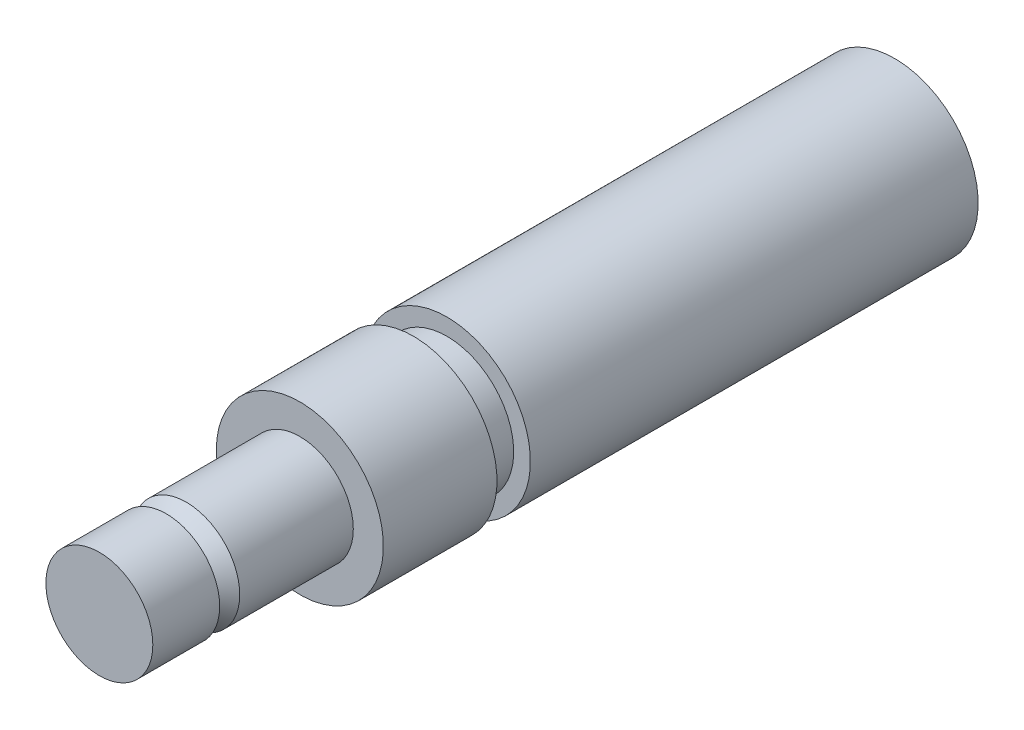
ISO-10303-21;
HEADER;
FILE_DESCRIPTION(('STEP AP214'),'2;1');
FILE_NAME('part.step','',(''),(''),'','','');
FILE_SCHEMA(('AUTOMOTIVE_DESIGN { 1 0 10303 214 1 1 1 1 }'));
ENDSEC;
DATA;
#1=APPLICATION_CONTEXT('core data for automotive mechanical design processes');
#2=APPLICATION_PROTOCOL_DEFINITION('international standard','automotive_design',2000,#1);
#3=PRODUCT_CONTEXT('',#1,'mechanical');
#4=PRODUCT('Part','Part','',(#3));
#5=PRODUCT_RELATED_PRODUCT_CATEGORY('part','',(#4));
#6=PRODUCT_DEFINITION_FORMATION('','',#4);
#7=PRODUCT_DEFINITION_CONTEXT('part definition',#1,'design');
#8=PRODUCT_DEFINITION('design','',#6,#7);
#9=PRODUCT_DEFINITION_SHAPE('','',#8);
#10=(LENGTH_UNIT() NAMED_UNIT(*) SI_UNIT(.MILLI.,.METRE.));
#11=(NAMED_UNIT(*) PLANE_ANGLE_UNIT() SI_UNIT($,.RADIAN.));
#12=(NAMED_UNIT(*) SI_UNIT($,.STERADIAN.) SOLID_ANGLE_UNIT());
#13=UNCERTAINTY_MEASURE_WITH_UNIT(LENGTH_MEASURE(1.E-05),#10,'distance_accuracy_value','');
#14=(GEOMETRIC_REPRESENTATION_CONTEXT(3) GLOBAL_UNCERTAINTY_ASSIGNED_CONTEXT((#13)) GLOBAL_UNIT_ASSIGNED_CONTEXT((#10,
#11,#12)) REPRESENTATION_CONTEXT('',''));
#15=CARTESIAN_POINT('',(0.,0.,0.));
#16=DIRECTION('',(0.,0.,1.));
#17=DIRECTION('',(1.,0.,0.));
#18=AXIS2_PLACEMENT_3D('',#15,#16,#17);
#19=CARTESIAN_POINT('',(0.,0.,10.9));
#20=DIRECTION('',(0.,0.,1.));
#21=DIRECTION('',(1.,0.,0.));
#22=AXIS2_PLACEMENT_3D('',#19,#20,#21);
#23=PLANE('',#22);
#24=CARTESIAN_POINT('',(0.,0.,10.9));
#25=DIRECTION('',(0.,0.,1.));
#26=DIRECTION('',(1.,0.,0.));
#27=AXIS2_PLACEMENT_3D('',#24,#25,#26);
#28=CIRCLE('',#27,0.8);
#29=CARTESIAN_POINT('',(0.8,0.,10.9));
#30=VERTEX_POINT('',#29);
#31=EDGE_CURVE('E20',#30,#30,#28,.F.);
#32=ORIENTED_EDGE('',*,*,#31,.F.);
#33=EDGE_LOOP('',(#32));
#34=FACE_BOUND('',#33,.T.);
#35=ADVANCED_FACE('F17',(#34),#23,.T.);
#36=CARTESIAN_POINT('',(0.,0.,9.9));
#37=DIRECTION('',(0.,0.,1.));
#38=DIRECTION('',(1.,0.,0.));
#39=AXIS2_PLACEMENT_3D('',#36,#37,#38);
#40=CYLINDRICAL_SURFACE('',#39,0.8);
#41=ORIENTED_EDGE('',*,*,#31,.T.);
#42=EDGE_LOOP('',(#41));
#43=FACE_BOUND('',#42,.T.);
#44=CARTESIAN_POINT('',(0.,0.,9.9));
#45=DIRECTION('',(0.,0.,1.));
#46=DIRECTION('',(1.,0.,0.));
#47=AXIS2_PLACEMENT_3D('',#44,#45,#46);
#48=CIRCLE('',#47,0.8);
#49=CARTESIAN_POINT('',(0.8,0.,9.9));
#50=VERTEX_POINT('',#49);
#51=EDGE_CURVE('E254',#50,#50,#48,.T.);
#52=ORIENTED_EDGE('',*,*,#51,.T.);
#53=EDGE_LOOP('',(#52));
#54=FACE_BOUND('',#53,.T.);
#55=ADVANCED_FACE('F229',(#43,#54),#40,.T.);
#56=CARTESIAN_POINT('',(0.,0.,9.9));
#57=DIRECTION('',(0.,0.,1.));
#58=DIRECTION('',(1.,0.,0.));
#59=AXIS2_PLACEMENT_3D('',#56,#57,#58);
#60=PLANE('',#59);
#61=CARTESIAN_POINT('',(0.,0.,9.90000000001601));
#62=DIRECTION('',(0.,0.,-1.));
#63=DIRECTION('',(-1.,0.,0.));
#64=AXIS2_PLACEMENT_3D('',#61,#62,#63);
#65=CIRCLE('',#64,0.499999999931333);
#66=CARTESIAN_POINT('',(-0.499999999931333,0.,9.90000000001601));
#67=VERTEX_POINT('',#66);
#68=EDGE_CURVE('E122',#67,#67,#65,.T.);
#69=ORIENTED_EDGE('',*,*,#68,.F.);
#70=EDGE_LOOP('',(#69));
#71=FACE_BOUND('',#70,.T.);
#72=ORIENTED_EDGE('',*,*,#51,.F.);
#73=EDGE_LOOP('',(#72));
#74=FACE_BOUND('',#73,.T.);
#75=ADVANCED_FACE('F220',(#71,#74),#60,.F.);
#76=CARTESIAN_POINT('',(0.,0.,9.60000000009131));
#77=DIRECTION('',(0.,0.,-1.));
#78=DIRECTION('',(-1.,0.,0.));
#79=AXIS2_PLACEMENT_3D('',#76,#77,#78);
#80=CONICAL_SURFACE('',#79,0.799999999856027,0.785398163397448);
#81=CARTESIAN_POINT('',(0.,0.,9.600000000002));
#82=DIRECTION('',(0.,0.,1.));
#83=DIRECTION('',(1.,0.,0.));
#84=AXIS2_PLACEMENT_3D('',#81,#82,#83);
#85=CIRCLE('',#84,0.8);
#86=CARTESIAN_POINT('',(0.8,0.,9.600000000002));
#87=VERTEX_POINT('',#86);
#88=EDGE_CURVE('E120',#87,#87,#85,.F.);
#89=ORIENTED_EDGE('',*,*,#88,.F.);
#90=EDGE_LOOP('',(#89));
#91=FACE_BOUND('',#90,.T.);
#92=ORIENTED_EDGE('',*,*,#68,.T.);
#93=EDGE_LOOP('',(#92));
#94=FACE_BOUND('',#93,.T.);
#95=ADVANCED_FACE('F211',(#91,#94),#80,.T.);
#96=CARTESIAN_POINT('',(0.,0.,7.9));
#97=DIRECTION('',(0.,0.,1.));
#98=DIRECTION('',(1.,0.,0.));
#99=AXIS2_PLACEMENT_3D('',#96,#97,#98);
#100=CYLINDRICAL_SURFACE('',#99,0.8);
#101=ORIENTED_EDGE('',*,*,#88,.T.);
#102=EDGE_LOOP('',(#101));
#103=FACE_BOUND('',#102,.T.);
#104=CARTESIAN_POINT('',(0.,0.,7.9));
#105=DIRECTION('',(0.,0.,1.));
#106=DIRECTION('',(1.,0.,0.));
#107=AXIS2_PLACEMENT_3D('',#104,#105,#106);
#108=CIRCLE('',#107,0.8);
#109=CARTESIAN_POINT('',(0.8,0.,7.9));
#110=VERTEX_POINT('',#109);
#111=EDGE_CURVE('E118',#110,#110,#108,.F.);
#112=ORIENTED_EDGE('',*,*,#111,.F.);
#113=EDGE_LOOP('',(#112));
#114=FACE_BOUND('',#113,.T.);
#115=ADVANCED_FACE('F42',(#103,#114),#100,.T.);
#116=CARTESIAN_POINT('',(0.,0.,7.9));
#117=DIRECTION('',(0.,0.,1.));
#118=DIRECTION('',(1.,0.,0.));
#119=AXIS2_PLACEMENT_3D('',#116,#117,#118);
#120=PLANE('',#119);
#121=ORIENTED_EDGE('',*,*,#111,.T.);
#122=EDGE_LOOP('',(#121));
#123=FACE_BOUND('',#122,.T.);
#124=CARTESIAN_POINT('',(0.,0.,7.9));
#125=DIRECTION('',(0.,0.,-1.));
#126=DIRECTION('',(-1.,0.,0.));
#127=AXIS2_PLACEMENT_3D('',#124,#125,#126);
#128=CIRCLE('',#127,1.25);
#129=CARTESIAN_POINT('',(-1.25,0.,7.9));
#130=VERTEX_POINT('',#129);
#131=EDGE_CURVE('E114',#130,#130,#128,.T.);
#132=ORIENTED_EDGE('',*,*,#131,.F.);
#133=EDGE_LOOP('',(#132));
#134=FACE_BOUND('',#133,.T.);
#135=ADVANCED_FACE('F31',(#123,#134),#120,.T.);
#136=CARTESIAN_POINT('',(0.,0.,4.9000000000774));
#137=DIRECTION('',(0.,0.,-1.));
#138=DIRECTION('',(-1.,0.,0.));
#139=AXIS2_PLACEMENT_3D('',#136,#137,#138);
#140=CONICAL_SURFACE('',#139,0.999999999748979,1.0297442583608);
#141=CARTESIAN_POINT('',(0.,0.,4.9));
#142=DIRECTION('',(0.,0.,-1.));
#143=DIRECTION('',(-1.,0.,0.));
#144=AXIS2_PLACEMENT_3D('',#141,#142,#143);
#145=CIRCLE('',#144,1.);
#146=CARTESIAN_POINT('',(-1.,0.,4.9));
#147=VERTEX_POINT('',#146);
#148=EDGE_CURVE('E111',#147,#147,#145,.T.);
#149=ORIENTED_EDGE('',*,*,#148,.T.);
#150=EDGE_LOOP('',(#149));
#151=FACE_BOUND('',#150,.T.);
#152=CARTESIAN_POINT('',(-2.55795384873636E-10,0.,5.50086061909383));
#153=VERTEX_POINT('',#152);
#154=VERTEX_LOOP('',#153);
#155=FACE_BOUND('',#154,.T.);
#156=ADVANCED_FACE('F28',(#151,#155),#140,.F.);
#157=CARTESIAN_POINT('',(0.,0.,6.6));
#158=DIRECTION('',(0.,0.,-1.));
#159=DIRECTION('',(-1.,0.,0.));
#160=AXIS2_PLACEMENT_3D('',#157,#158,#159);
#161=CYLINDRICAL_SURFACE('',#160,1.25);
#162=CARTESIAN_POINT('',(0.,0.,6.2));
#163=DIRECTION('',(0.,0.,-1.));
#164=DIRECTION('',(-1.,0.,0.));
#165=AXIS2_PLACEMENT_3D('',#162,#163,#164);
#166=CIRCLE('',#165,1.25);
#167=CARTESIAN_POINT('',(-1.25,0.,6.2));
#168=VERTEX_POINT('',#167);
#169=EDGE_CURVE('E94',#168,#168,#166,.T.);
#170=ORIENTED_EDGE('',*,*,#169,.F.);
#171=EDGE_LOOP('',(#170));
#172=FACE_BOUND('',#171,.T.);
#173=ORIENTED_EDGE('',*,*,#131,.T.);
#174=EDGE_LOOP('',(#173));
#175=FACE_BOUND('',#174,.T.);
#176=ADVANCED_FACE('F30',(#172,#175),#161,.T.);
#177=CARTESIAN_POINT('',(0.,0.,0.));
#178=DIRECTION('',(0.,0.,-1.));
#179=DIRECTION('',(-1.,0.,0.));
#180=AXIS2_PLACEMENT_3D('',#177,#178,#179);
#181=CYLINDRICAL_SURFACE('',#180,1.);
#182=CARTESIAN_POINT('',(0.,0.,-0.900000000001455));
#183=DIRECTION('',(0.,0.,-1.));
#184=DIRECTION('',(-1.,0.,0.));
#185=AXIS2_PLACEMENT_3D('',#182,#183,#184);
#186=CIRCLE('',#185,1.0000000000332);
#187=CARTESIAN_POINT('',(-1.0000000000332,0.,-0.900000000001455));
#188=VERTEX_POINT('',#187);
#189=EDGE_CURVE('E93',#188,#188,#186,.T.);
#190=ORIENTED_EDGE('',*,*,#189,.T.);
#191=EDGE_LOOP('',(#190));
#192=FACE_BOUND('',#191,.T.);
#193=CARTESIAN_POINT('',(0.,-1.,2.));
#194=CARTESIAN_POINT('',(0.0263072941996314,-0.99999882698595,2.00000133279081));
#195=CARTESIAN_POINT('',(0.0526293395636614,-0.998951575800265,2.00208682774252));
#196=CARTESIAN_POINT('',(0.104480295938417,-0.994868016465658,2.01033200327454));
#197=CARTESIAN_POINT('',(0.130008377804639,-0.99182969755529,2.01649580255873));
#198=CARTESIAN_POINT('',(0.179464997117567,-0.984081797255653,2.03259608555001));
#199=CARTESIAN_POINT('',(0.203398845810369,-0.97937813296223,2.04251922068789));
#200=CARTESIAN_POINT('',(0.249231794197029,-0.968730052928922,2.06578267799852));
#201=CARTESIAN_POINT('',(0.271130652545689,-0.962785490292046,2.07912340478677));
#202=CARTESIAN_POINT('',(0.313754382806793,-0.949781164602393,2.10975892503895));
#203=CARTESIAN_POINT('',(0.334328404641299,-0.942675724884289,2.12724390615065));
#204=CARTESIAN_POINT('',(0.37239037349671,-0.928299574229738,2.16526152170779));
#205=CARTESIAN_POINT('',(0.389876087308891,-0.921028747953146,2.18579634195166));
#206=CARTESIAN_POINT('',(0.422625970473862,-0.906494771172166,2.23124162737727));
#207=CARTESIAN_POINT('',(0.437612609390989,-0.899275963527821,2.25636794920579));
#208=CARTESIAN_POINT('',(0.463084070743218,-0.886429916161665,2.30918355840129));
#209=CARTESIAN_POINT('',(0.473572091350341,-0.880801546735004,2.33687100792304));
#210=CARTESIAN_POINT('',(0.489066211797564,-0.872289340449792,2.39233251820209));
#211=CARTESIAN_POINT('',(0.494362915132875,-0.869261365623398,2.4200021547411));
#212=CARTESIAN_POINT('',(0.500213494969292,-0.865909450690678,2.47598934591223));
#213=CARTESIAN_POINT('',(0.500772046188479,-0.865582845388517,2.5043062342861));
#214=CARTESIAN_POINT('',(0.497343642670328,-0.867554651968385,2.55714303093501));
#215=CARTESIAN_POINT('',(0.493892275474725,-0.869543821343265,2.58171205281882));
#216=CARTESIAN_POINT('',(0.48346991301851,-0.875381149456658,2.62986099048183));
#217=CARTESIAN_POINT('',(0.476497801916354,-0.879229897541171,2.6534405901123));
#218=CARTESIAN_POINT('',(0.459104800009827,-0.888437431778655,2.69961481508525));
#219=CARTESIAN_POINT('',(0.448607323306903,-0.893829318514657,2.72217367977794));
#220=CARTESIAN_POINT('',(0.424520538951912,-0.905517156168784,2.76531758850668));
#221=CARTESIAN_POINT('',(0.410929908291427,-0.911813493513579,2.7859017825627));
#222=CARTESIAN_POINT('',(0.379034666571405,-0.925565108151549,2.82725857113129));
#223=CARTESIAN_POINT('',(0.360350958372443,-0.933066147102269,2.8477245814866));
#224=CARTESIAN_POINT('',(0.319781661723617,-0.947736771952603,2.88536451225023));
#225=CARTESIAN_POINT('',(0.297893957434164,-0.954906134672052,2.90253623974699));
#226=CARTESIAN_POINT('',(0.250245525427099,-0.968513828138163,2.93385170040973));
#227=CARTESIAN_POINT('',(0.22435125280626,-0.974902069337732,2.94781553602781));
#228=CARTESIAN_POINT('',(0.170197879751449,-0.985794490438822,2.97105931648312));
#229=CARTESIAN_POINT('',(0.141943396215306,-0.990302249828193,2.98034816715722));
#230=CARTESIAN_POINT('',(0.0945428295096843,-0.995694761416512,2.99134610550181));
#231=CARTESIAN_POINT('',(0.0758201648790603,-0.997300886356791,2.99458315205222));
#232=CARTESIAN_POINT('',(0.0380675547500793,-0.999453877599474,2.99891047518163));
#233=CARTESIAN_POINT('',(0.0190376398898653,-1.00000084886796,3.00000096449264));
#234=CARTESIAN_POINT('',(-0.0263072941996313,-0.999998826985951,2.99999866720919));
#235=CARTESIAN_POINT('',(-0.0526293395636612,-0.998951575800265,2.99791317225748));
#236=CARTESIAN_POINT('',(-0.104480295938416,-0.994868016465658,2.98966799672546));
#237=CARTESIAN_POINT('',(-0.130008377804639,-0.99182969755529,2.98350419744127));
#238=CARTESIAN_POINT('',(-0.179464997117567,-0.984081797255653,2.96740391444999));
#239=CARTESIAN_POINT('',(-0.203398845810369,-0.97937813296223,2.95748077931211));
#240=CARTESIAN_POINT('',(-0.249231794197029,-0.968730052928923,2.93421732200148));
#241=CARTESIAN_POINT('',(-0.271130652545689,-0.962785490292046,2.92087659521323));
#242=CARTESIAN_POINT('',(-0.313754382806793,-0.949781164602393,2.89024107496105));
#243=CARTESIAN_POINT('',(-0.334328404641299,-0.942675724884288,2.87275609384935));
#244=CARTESIAN_POINT('',(-0.37239037349671,-0.928299574229737,2.83473847829221));
#245=CARTESIAN_POINT('',(-0.389876087308891,-0.921028747953146,2.81420365804834));
#246=CARTESIAN_POINT('',(-0.422625970473861,-0.906494771172166,2.76875837262273));
#247=CARTESIAN_POINT('',(-0.437612609390989,-0.899275963527821,2.74363205079421));
#248=CARTESIAN_POINT('',(-0.463084070743217,-0.886429916161665,2.69081644159871));
#249=CARTESIAN_POINT('',(-0.47357209135034,-0.880801546735004,2.66312899207696));
#250=CARTESIAN_POINT('',(-0.489066211797564,-0.872289340449792,2.60766748179791));
#251=CARTESIAN_POINT('',(-0.494362915132875,-0.869261365623398,2.5799978452589));
#252=CARTESIAN_POINT('',(-0.500213494969292,-0.865909450690678,2.52401065408777));
#253=CARTESIAN_POINT('',(-0.500772046188479,-0.865582845388517,2.4956937657139));
#254=CARTESIAN_POINT('',(-0.497343642670328,-0.867554651968385,2.44285696906499));
#255=CARTESIAN_POINT('',(-0.493892275474725,-0.869543821343265,2.41828794718118));
#256=CARTESIAN_POINT('',(-0.48346991301851,-0.875381149456659,2.37013900951817));
#257=CARTESIAN_POINT('',(-0.476497801916354,-0.879229897541171,2.3465594098877));
#258=CARTESIAN_POINT('',(-0.459104800009827,-0.888437431778655,2.30038518491475));
#259=CARTESIAN_POINT('',(-0.448607323306903,-0.893829318514657,2.27782632022206));
#260=CARTESIAN_POINT('',(-0.424520538951912,-0.905517156168784,2.23468241149332));
#261=CARTESIAN_POINT('',(-0.410929908291427,-0.911813493513579,2.2140982174373));
#262=CARTESIAN_POINT('',(-0.379034666571405,-0.925565108151549,2.17274142886871));
#263=CARTESIAN_POINT('',(-0.360350958372443,-0.933066147102269,2.1522754185134));
#264=CARTESIAN_POINT('',(-0.319781661723617,-0.947736771952603,2.11463548774977));
#265=CARTESIAN_POINT('',(-0.297893957434164,-0.954906134672052,2.09746376025301));
#266=CARTESIAN_POINT('',(-0.250245525427099,-0.968513828138163,2.06614829959028));
#267=CARTESIAN_POINT('',(-0.22435125280626,-0.974902069337732,2.05218446397219));
#268=CARTESIAN_POINT('',(-0.170197879751449,-0.985794490438821,2.02894068351688));
#269=CARTESIAN_POINT('',(-0.141943396215306,-0.990302249828193,2.01965183284278));
#270=CARTESIAN_POINT('',(-0.0945428295096842,-0.995694761416512,2.00865389449819));
#271=CARTESIAN_POINT('',(-0.0758201648790601,-0.997300886356792,2.00541684794778));
#272=CARTESIAN_POINT('',(-0.0380675547500791,-0.999453877599475,2.00108952481837));
#273=CARTESIAN_POINT('',(-0.0190376398898652,-1.00000084886796,1.99999903550736));
#274=CARTESIAN_POINT('',(0.,-1.,2.));
#275=B_SPLINE_CURVE_WITH_KNOTS('',3,(#193,#194,#195,#196,#197,#198,#199,#200,#201,#202,#203,
#204,#205,#206,#207,#208,#209,#210,#211,#212,#213,#214,#215,#216,#217,#218,#219,#220,#221,#222,
#223,#224,#225,#226,#227,#228,#229,#230,#231,#232,#233,#234,#235,#236,#237,#238,#239,#240,#241,
#242,#243,#244,#245,#246,#247,#248,#249,#250,#251,#252,#253,#254,#255,#256,#257,#258,#259,#260,
#261,#262,#263,#264,#265,#266,#267,#268,#269,#270,#271,#272,#273,#274),.UNSPECIFIED.,.T.,.F.,(4,
2,2,2,2,2,2,2,2,2,2,2,2,2,2,2,2,2,2,2,2,2,2,2,2,2,2,2,2,2,2,2,2,2,2,2,2,2,2,2,4),(0.,
0.0788471601427699,0.157774070291331,0.236423315979063,0.315081877414698,0.398492461227113,
0.481963115900232,0.57190845151623,0.661789736496116,0.746289949381505,0.830706783628623,
0.90502861517784,0.979374016599774,1.05545200908198,1.13156260311418,1.21731669237686,
1.30312766914582,1.39296528035204,1.48263109709754,1.53969559841525,1.59675444413864,
1.67560160428141,1.75452851442997,1.83317776011771,1.91183632155334,1.99524690536576,
2.07871756003888,2.16866289565487,2.25854418063476,2.34304439352015,2.42746122776727,
2.50178305931648,2.57612846073842,2.65220645322063,2.72831704725283,2.8140711365155,
2.89988211328446,2.98971972449069,3.07938554123619,3.1364500425539,3.19350888827729),.UNSPECIFIED.);
#276=CARTESIAN_POINT('',(0.,-1.,2.));
#277=VERTEX_POINT('',#276);
#278=EDGE_CURVE('E85',#277,#277,#275,.T.);
#279=ORIENTED_EDGE('',*,*,#278,.T.);
#280=EDGE_LOOP('',(#279));
#281=FACE_BOUND('',#280,.T.);
#282=ORIENTED_EDGE('',*,*,#148,.F.);
#283=EDGE_LOOP('',(#282));
#284=FACE_BOUND('',#283,.T.);
#285=ADVANCED_FACE('F39',(#192,#281,#284),#181,.F.);
#286=CARTESIAN_POINT('',(0.95,0.,6.2));
#287=DIRECTION('',(0.,0.,-1.));
#288=DIRECTION('',(-1.,0.,0.));
#289=AXIS2_PLACEMENT_3D('',#286,#287,#288);
#290=PLANE('',#289);
#291=CARTESIAN_POINT('',(0.,0.,6.2));
#292=DIRECTION('',(0.,0.,-1.));
#293=DIRECTION('',(-1.,0.,0.));
#294=AXIS2_PLACEMENT_3D('',#291,#292,#293);
#295=CIRCLE('',#294,1.);
#296=CARTESIAN_POINT('',(-1.,0.,6.2));
#297=VERTEX_POINT('',#296);
#298=EDGE_CURVE('E92',#297,#297,#295,.T.);
#299=ORIENTED_EDGE('',*,*,#298,.F.);
#300=EDGE_LOOP('',(#299));
#301=FACE_BOUND('',#300,.T.);
#302=ORIENTED_EDGE('',*,*,#169,.T.);
#303=EDGE_LOOP('',(#302));
#304=FACE_BOUND('',#303,.T.);
#305=ADVANCED_FACE('F98',(#301,#304),#290,.T.);
#306=CARTESIAN_POINT('',(0.,0.,-0.999999999976353));
#307=DIRECTION('',(0.,0.,-1.));
#308=DIRECTION('',(-1.,0.,0.));
#309=AXIS2_PLACEMENT_3D('',#306,#307,#308);
#310=CONICAL_SURFACE('',#309,1.10000000000809,0.785398163397448);
#311=CARTESIAN_POINT('',(0.,0.,-0.999999999976353));
#312=DIRECTION('',(0.,0.,-1.));
#313=DIRECTION('',(-1.,0.,0.));
#314=AXIS2_PLACEMENT_3D('',#311,#312,#313);
#315=CIRCLE('',#314,1.10000000000809);
#316=CARTESIAN_POINT('',(-1.10000000000809,0.,-0.999999999976353));
#317=VERTEX_POINT('',#316);
#318=EDGE_CURVE('E71',#317,#317,#315,.F.);
#319=ORIENTED_EDGE('',*,*,#318,.F.);
#320=EDGE_LOOP('',(#319));
#321=FACE_BOUND('',#320,.T.);
#322=ORIENTED_EDGE('',*,*,#189,.F.);
#323=EDGE_LOOP('',(#322));
#324=FACE_BOUND('',#323,.T.);
#325=ADVANCED_FACE('F80',(#321,#324),#310,.F.);
#326=CARTESIAN_POINT('',(0.,-10.,2.5));
#327=DIRECTION('',(0.,1.,0.));
#328=DIRECTION('',(0.,0.,1.));
#329=AXIS2_PLACEMENT_3D('',#326,#327,#328);
#330=CYLINDRICAL_SURFACE('',#329,0.5);
#331=ORIENTED_EDGE('',*,*,#278,.F.);
#332=EDGE_LOOP('',(#331));
#333=FACE_BOUND('',#332,.T.);
#334=CARTESIAN_POINT('',(0.,-1.25,3.));
#335=CARTESIAN_POINT('',(0.0269039658910112,-1.2499987602367,2.99999843526084));
#336=CARTESIAN_POINT('',(0.0538314236338625,-1.24912224361303,2.99781797004808));
#337=CARTESIAN_POINT('',(0.106904177585058,-1.24570522010588,2.9891795332913));
#338=CARTESIAN_POINT('',(0.133048294881686,-1.24316232515178,2.98271542274691));
#339=CARTESIAN_POINT('',(0.183735176026268,-1.23668610501994,2.96578246258056));
#340=CARTESIAN_POINT('',(0.20828219544184,-1.23275667054154,2.95532481234677));
#341=CARTESIAN_POINT('',(0.255260225119674,-1.22389316700826,2.93074991606284));
#342=CARTESIAN_POINT('',(0.277691262741417,-1.21895911094567,2.91663271733922));
#343=CARTESIAN_POINT('',(0.320876192673805,-1.20832700529545,2.88444048387529));
#344=CARTESIAN_POINT('',(0.341517205742932,-1.20260529448817,2.86622190858505));
#345=CARTESIAN_POINT('',(0.379545092300614,-1.1911509928089,2.82664832651192));
#346=CARTESIAN_POINT('',(0.396930629375506,-1.18541839844026,2.80529203805068));
#347=CARTESIAN_POINT('',(0.428718532311999,-1.17430701992359,2.75889315072488));
#348=CARTESIAN_POINT('',(0.442953546182462,-1.16895536532779,2.73372873363027));
#349=CARTESIAN_POINT('',(0.466938540903067,-1.15958417463853,2.6811162865088));
#350=CARTESIAN_POINT('',(0.476690589237171,-1.15556402471244,2.65366931607605));
#351=CARTESIAN_POINT('',(0.490974704979323,-1.14956589467383,2.59857192176988));
#352=CARTESIAN_POINT('',(0.495723489799348,-1.14750355168887,2.57098720211134));
#353=CARTESIAN_POINT('',(0.500543240129584,-1.14541001016283,2.51534126171609));
#354=CARTESIAN_POINT('',(0.500616504086554,-1.14537781361892,2.4872802818914));
#355=CARTESIAN_POINT('',(0.496247343729738,-1.14727625006616,2.43356084985857));
#356=CARTESIAN_POINT('',(0.492118835602052,-1.14907043513437,2.40787110665854));
#357=CARTESIAN_POINT('',(0.479986729710618,-1.15419046441189,2.35758514479415));
#358=CARTESIAN_POINT('',(0.471982450471788,-1.15751657797446,2.33298911926837));
#359=CARTESIAN_POINT('',(0.452173486343469,-1.16539879319659,2.28499505189772));
#360=CARTESIAN_POINT('',(0.440294505275784,-1.16997863359157,2.2616317475432));
#361=CARTESIAN_POINT('',(0.413125975969637,-1.17984550493431,2.21714518837486));
#362=CARTESIAN_POINT('',(0.397835284094052,-1.18513277277984,2.1960226882107));
#363=CARTESIAN_POINT('',(0.362890311363167,-1.19631601636523,2.1549006119779));
#364=CARTESIAN_POINT('',(0.342990349410306,-1.20222747908108,2.13511348567605));
#365=CARTESIAN_POINT('',(0.300084867017248,-1.21364798666515,2.09908349393353));
#366=CARTESIAN_POINT('',(0.277077849890487,-1.21915683560871,2.08284234653902));
#367=CARTESIAN_POINT('',(0.228001857369608,-1.22929057672909,2.05408476089534));
#368=CARTESIAN_POINT('',(0.201880031972326,-1.23389516416435,2.04165098435088));
#369=CARTESIAN_POINT('',(0.147708926457032,-1.24154168164919,2.02144583402373));
#370=CARTESIAN_POINT('',(0.119663640074804,-1.24458674468525,2.01366510723876));
#371=CARTESIAN_POINT('',(0.0761216373230209,-1.24777141867635,2.00559218303427));
#372=CARTESIAN_POINT('',(0.0609880034263913,-1.24860407312103,2.00349848923693));
#373=CARTESIAN_POINT('',(0.0305721078741395,-1.24971871347637,2.00070195963826));
#374=CARTESIAN_POINT('',(0.0152898476194676,-1.25000070457254,1.99999911073957));
#375=CARTESIAN_POINT('',(-0.0269039658909137,-1.24999876023691,2.00000156473862));
#376=CARTESIAN_POINT('',(-0.053831423633756,-1.2491222436131,2.00218202995176));
#377=CARTESIAN_POINT('',(-0.106904177584983,-1.24570522010583,2.01082046670882));
#378=CARTESIAN_POINT('',(-0.13304829488165,-1.24316232515177,2.01728457725312));
#379=CARTESIAN_POINT('',(-0.183735176026278,-1.23668610501995,2.03421753741941));
#380=CARTESIAN_POINT('',(-0.208282195441858,-1.23275667054154,2.04467518765322));
#381=CARTESIAN_POINT('',(-0.25526022511969,-1.22389316700825,2.06925008393718));
#382=CARTESIAN_POINT('',(-0.277691262741425,-1.21895911094567,2.08336728266078));
#383=CARTESIAN_POINT('',(-0.320876192673802,-1.20832700529545,2.1155595161247));
#384=CARTESIAN_POINT('',(-0.341517205742926,-1.20260529448818,2.13377809141494));
#385=CARTESIAN_POINT('',(-0.379545092300609,-1.1911509928089,2.17335167348808));
#386=CARTESIAN_POINT('',(-0.396930629375503,-1.18541839844026,2.19470796194932));
#387=CARTESIAN_POINT('',(-0.428718532312,-1.17430701992359,2.24110684927512));
#388=CARTESIAN_POINT('',(-0.442953546182464,-1.16895536532779,2.26627126636973));
#389=CARTESIAN_POINT('',(-0.466938540903068,-1.15958417463853,2.31888371349121));
#390=CARTESIAN_POINT('',(-0.476690589237172,-1.15556402471244,2.34633068392396));
#391=CARTESIAN_POINT('',(-0.490974704979323,-1.14956589467383,2.40142807823012));
#392=CARTESIAN_POINT('',(-0.495723489799348,-1.14750355168887,2.42901279788866));
#393=CARTESIAN_POINT('',(-0.500543240129584,-1.14541001016283,2.48465873828391));
#394=CARTESIAN_POINT('',(-0.500616504086554,-1.14537781361892,2.5127197181086));
#395=CARTESIAN_POINT('',(-0.496247343729738,-1.14727625006616,2.56643915014143));
#396=CARTESIAN_POINT('',(-0.492118835602053,-1.14907043513437,2.59212889334145));
#397=CARTESIAN_POINT('',(-0.479986729710618,-1.15419046441189,2.64241485520585));
#398=CARTESIAN_POINT('',(-0.471982450471788,-1.15751657797446,2.66701088073163));
#399=CARTESIAN_POINT('',(-0.452173486343468,-1.16539879319659,2.71500494810228));
#400=CARTESIAN_POINT('',(-0.440294505275782,-1.16997863359157,2.73836825245681));
#401=CARTESIAN_POINT('',(-0.413125975969635,-1.17984550493431,2.78285481162514));
#402=CARTESIAN_POINT('',(-0.397835284094051,-1.18513277277984,2.8039773117893));
#403=CARTESIAN_POINT('',(-0.362890311363171,-1.19631601636523,2.84509938802209));
#404=CARTESIAN_POINT('',(-0.342990349410315,-1.20222747908108,2.86488651432394));
#405=CARTESIAN_POINT('',(-0.300084867017258,-1.21364798666515,2.90091650606646));
#406=CARTESIAN_POINT('',(-0.277077849890492,-1.21915683560871,2.91715765346098));
#407=CARTESIAN_POINT('',(-0.228001857369599,-1.22929057672909,2.94591523910467));
#408=CARTESIAN_POINT('',(-0.201880031972306,-1.23389516416436,2.95834901564914));
#409=CARTESIAN_POINT('',(-0.147708926457009,-1.24154168164919,2.97855416597626));
#410=CARTESIAN_POINT('',(-0.119663640074791,-1.24458674468523,2.98633489276118));
#411=CARTESIAN_POINT('',(-0.0761216373230165,-1.24777141867636,2.99440781696577));
#412=CARTESIAN_POINT('',(-0.0609880034263835,-1.24860407312107,2.99650151076316));
#413=CARTESIAN_POINT('',(-0.0305721078741028,-1.24971871347634,2.99929804036165));
#414=CARTESIAN_POINT('',(-0.0152898476194052,-1.25000070457241,3.0000008892601));
#415=CARTESIAN_POINT('',(0.,-1.25,3.));
#416=B_SPLINE_CURVE_WITH_KNOTS('',3,(#334,#335,#336,#337,#338,#339,#340,#341,#342,#343,#344,
#345,#346,#347,#348,#349,#350,#351,#352,#353,#354,#355,#356,#357,#358,#359,#360,#361,#362,#363,
#364,#365,#366,#367,#368,#369,#370,#371,#372,#373,#374,#375,#376,#377,#378,#379,#380,#381,#382,
#383,#384,#385,#386,#387,#388,#389,#390,#391,#392,#393,#394,#395,#396,#397,#398,#399,#400,#401,
#402,#403,#404,#405,#406,#407,#408,#409,#410,#411,#412,#413,#414,#415),.UNSPECIFIED.,.T.,.F.,(4,
2,2,2,2,2,2,2,2,2,2,2,2,2,2,2,2,2,2,2,2,2,2,2,2,2,2,2,2,2,2,2,2,2,2,2,2,2,2,2,4),(0.,
0.080652534393332,0.161420904663605,0.241964413922652,0.322506881617597,0.406496731500265,
0.490520985040354,0.578287528933609,0.666013555357818,0.749760244127704,0.833465763411976,
0.911345765270774,0.989239465710285,1.06872441684868,1.14823605221628,1.23388368780414,
1.31957272850403,1.40700823809413,1.49426739935935,1.54010363698509,1.58593944297693,
1.66659197737029,1.74736034764066,1.82790385689974,1.90844632459466,1.99243617447731,
2.07646042801741,2.16422697191067,2.25195299833488,2.33569968710476,2.41940520638904,
2.49728520824783,2.57517890868735,2.65466385982575,2.73417549519334,2.81982313078118,
2.90551217148109,2.99294768107123,3.08020684233641,3.12604307996217,3.17187888595406),.UNSPECIFIED.);
#417=CARTESIAN_POINT('',(0.,-1.25,3.));
#418=VERTEX_POINT('',#417);
#419=EDGE_CURVE('E62',#418,#418,#416,.T.);
#420=ORIENTED_EDGE('',*,*,#419,.F.);
#421=EDGE_LOOP('',(#420));
#422=FACE_BOUND('',#421,.T.);
#423=ADVANCED_FACE('F74',(#333,#422),#330,.F.);
#424=CARTESIAN_POINT('',(0.,0.,6.2));
#425=DIRECTION('',(0.,0.,-1.));
#426=DIRECTION('',(-1.,0.,0.));
#427=AXIS2_PLACEMENT_3D('',#424,#425,#426);
#428=CYLINDRICAL_SURFACE('',#427,1.);
#429=CARTESIAN_POINT('',(0.,0.,5.7));
#430=DIRECTION('',(0.,0.,-1.));
#431=DIRECTION('',(-1.,0.,0.));
#432=AXIS2_PLACEMENT_3D('',#429,#430,#431);
#433=CIRCLE('',#432,1.);
#434=CARTESIAN_POINT('',(-1.,0.,5.7));
#435=VERTEX_POINT('',#434);
#436=EDGE_CURVE('E70',#435,#435,#433,.T.);
#437=ORIENTED_EDGE('',*,*,#436,.F.);
#438=EDGE_LOOP('',(#437));
#439=FACE_BOUND('',#438,.T.);
#440=ORIENTED_EDGE('',*,*,#298,.T.);
#441=EDGE_LOOP('',(#440));
#442=FACE_BOUND('',#441,.T.);
#443=ADVANCED_FACE('F79',(#439,#442),#428,.T.);
#444=CARTESIAN_POINT('',(0.,0.,-1.));
#445=DIRECTION('',(0.,0.,-1.));
#446=DIRECTION('',(-1.,0.,0.));
#447=AXIS2_PLACEMENT_3D('',#444,#445,#446);
#448=PLANE('',#447);
#449=ORIENTED_EDGE('',*,*,#318,.T.);
#450=EDGE_LOOP('',(#449));
#451=FACE_BOUND('',#450,.T.);
#452=CARTESIAN_POINT('',(0.,0.,-1.));
#453=DIRECTION('',(0.,0.,-1.));
#454=DIRECTION('',(-1.,0.,0.));
#455=AXIS2_PLACEMENT_3D('',#452,#453,#454);
#456=CIRCLE('',#455,1.25);
#457=CARTESIAN_POINT('',(-1.25,0.,-1.));
#458=VERTEX_POINT('',#457);
#459=EDGE_CURVE('E24',#458,#458,#456,.F.);
#460=ORIENTED_EDGE('',*,*,#459,.F.);
#461=EDGE_LOOP('',(#460));
#462=FACE_BOUND('',#461,.T.);
#463=ADVANCED_FACE('F54',(#451,#462),#448,.T.);
#464=CARTESIAN_POINT('',(1.25,0.,5.7));
#465=DIRECTION('',(0.,0.,1.));
#466=DIRECTION('',(1.,0.,0.));
#467=AXIS2_PLACEMENT_3D('',#464,#465,#466);
#468=PLANE('',#467);
#469=ORIENTED_EDGE('',*,*,#436,.T.);
#470=EDGE_LOOP('',(#469));
#471=FACE_BOUND('',#470,.T.);
#472=CARTESIAN_POINT('',(0.,0.,5.7));
#473=DIRECTION('',(0.,0.,-1.));
#474=DIRECTION('',(-1.,0.,0.));
#475=AXIS2_PLACEMENT_3D('',#472,#473,#474);
#476=CIRCLE('',#475,1.25);
#477=CARTESIAN_POINT('',(-1.25,0.,5.7));
#478=VERTEX_POINT('',#477);
#479=EDGE_CURVE('E11',#478,#478,#476,.T.);
#480=ORIENTED_EDGE('',*,*,#479,.F.);
#481=EDGE_LOOP('',(#480));
#482=FACE_BOUND('',#481,.T.);
#483=ADVANCED_FACE('F48',(#471,#482),#468,.T.);
#484=CARTESIAN_POINT('',(0.,0.,6.6));
#485=DIRECTION('',(0.,0.,-1.));
#486=DIRECTION('',(-1.,0.,0.));
#487=AXIS2_PLACEMENT_3D('',#484,#485,#486);
#488=CYLINDRICAL_SURFACE('',#487,1.25);
#489=ORIENTED_EDGE('',*,*,#459,.T.);
#490=EDGE_LOOP('',(#489));
#491=FACE_BOUND('',#490,.T.);
#492=ORIENTED_EDGE('',*,*,#479,.T.);
#493=EDGE_LOOP('',(#492));
#494=FACE_BOUND('',#493,.T.);
#495=ORIENTED_EDGE('',*,*,#419,.T.);
#496=EDGE_LOOP('',(#495));
#497=FACE_BOUND('',#496,.T.);
#498=ADVANCED_FACE('F46',(#491,#494,#497),#488,.T.);
#499=CLOSED_SHELL('',(#35,#55,#75,#95,#115,#135,#156,#176,#285,#305,#325,#423,#443,#463,#483,#498));
#500=MANIFOLD_SOLID_BREP('B1',#499);
#501=ADVANCED_BREP_SHAPE_REPRESENTATION('',(#18,#500),#14);
#502=SHAPE_DEFINITION_REPRESENTATION(#9,#501);
ENDSEC;
END-ISO-10303-21;
